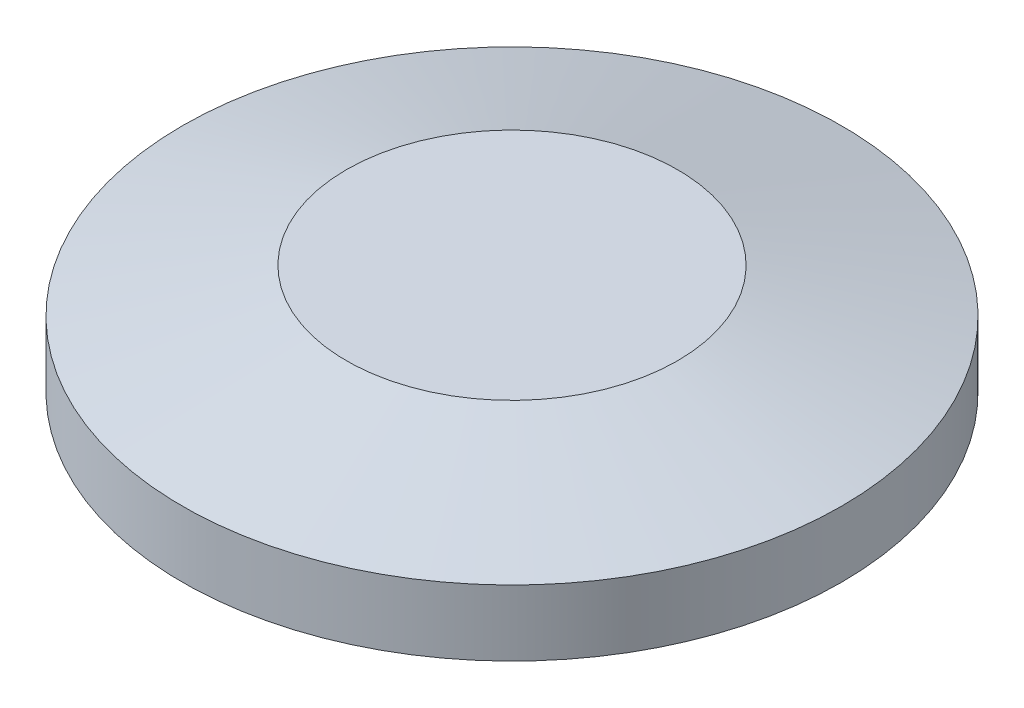
ISO-10303-21;
HEADER;
FILE_DESCRIPTION(('STEP AP214'),'2;1');
FILE_NAME('part.step','',(''),(''),'','','');
FILE_SCHEMA(('AUTOMOTIVE_DESIGN { 1 0 10303 214 1 1 1 1 }'));
ENDSEC;
DATA;
#1=APPLICATION_CONTEXT('core data for automotive mechanical design processes');
#2=APPLICATION_PROTOCOL_DEFINITION('international standard','automotive_design',2000,#1);
#3=PRODUCT_CONTEXT('',#1,'mechanical');
#4=PRODUCT('Part','Part','',(#3));
#5=PRODUCT_RELATED_PRODUCT_CATEGORY('part','',(#4));
#6=PRODUCT_DEFINITION_FORMATION('','',#4);
#7=PRODUCT_DEFINITION_CONTEXT('part definition',#1,'design');
#8=PRODUCT_DEFINITION('design','',#6,#7);
#9=PRODUCT_DEFINITION_SHAPE('','',#8);
#10=(LENGTH_UNIT() NAMED_UNIT(*) SI_UNIT(.MILLI.,.METRE.));
#11=(NAMED_UNIT(*) PLANE_ANGLE_UNIT() SI_UNIT($,.RADIAN.));
#12=(NAMED_UNIT(*) SI_UNIT($,.STERADIAN.) SOLID_ANGLE_UNIT());
#13=UNCERTAINTY_MEASURE_WITH_UNIT(LENGTH_MEASURE(1.E-05),#10,'distance_accuracy_value','');
#14=(GEOMETRIC_REPRESENTATION_CONTEXT(3) GLOBAL_UNCERTAINTY_ASSIGNED_CONTEXT((#13)) GLOBAL_UNIT_ASSIGNED_CONTEXT((#10,
#11,#12)) REPRESENTATION_CONTEXT('',''));
#15=CARTESIAN_POINT('',(0.,0.,0.));
#16=DIRECTION('',(0.,0.,1.));
#17=DIRECTION('',(1.,0.,0.));
#18=AXIS2_PLACEMENT_3D('',#15,#16,#17);
#19=CARTESIAN_POINT('',(0.,-2.5,0.));
#20=DIRECTION('',(0.,-1.,0.));
#21=DIRECTION('',(0.,0.,-1.));
#22=AXIS2_PLACEMENT_3D('',#19,#20,#21);
#23=PLANE('',#22);
#24=CARTESIAN_POINT('',(0.,-2.5,0.));
#25=DIRECTION('',(0.,1.,0.));
#26=DIRECTION('',(-1.,0.,0.));
#27=AXIS2_PLACEMENT_3D('',#24,#25,#26);
#28=CIRCLE('',#27,8.);
#29=CARTESIAN_POINT('',(8.,-2.5,0.));
#30=VERTEX_POINT('',#29);
#31=EDGE_CURVE('E28',#30,#30,#28,.T.);
#32=ORIENTED_EDGE('',*,*,#31,.F.);
#33=EDGE_LOOP('',(#32));
#34=FACE_BOUND('',#33,.T.);
#35=ADVANCED_FACE('F17',(#34),#23,.T.);
#36=CARTESIAN_POINT('',(0.,0.25,0.));
#37=DIRECTION('',(0.,-1.,0.));
#38=DIRECTION('',(-1.,0.,0.));
#39=AXIS2_PLACEMENT_3D('',#36,#37,#38);
#40=CYLINDRICAL_SURFACE('',#39,8.);
#41=ORIENTED_EDGE('',*,*,#31,.T.);
#42=DIRECTION('',(0.,-1.,0.));
#43=VECTOR('',#42,1.);
#44=CARTESIAN_POINT('',(8.,0.25,0.));
#45=LINE('',#44,#43);
#46=CARTESIAN_POINT('',(8.,-5.,0.));
#47=VERTEX_POINT('',#46);
#48=EDGE_CURVE('E11',#30,#47,#45,.T.);
#49=ORIENTED_EDGE('',*,*,#48,.T.);
#50=CARTESIAN_POINT('',(0.,-5.,0.));
#51=DIRECTION('',(0.,-1.,0.));
#52=DIRECTION('',(-1.,0.,0.));
#53=AXIS2_PLACEMENT_3D('',#50,#51,#52);
#54=CIRCLE('',#53,8.);
#55=EDGE_CURVE('E62',#47,#47,#54,.T.);
#56=ORIENTED_EDGE('',*,*,#55,.T.);
#57=ORIENTED_EDGE('',*,*,#48,.F.);
#58=EDGE_LOOP('',(#41,#49,#56,#57));
#59=FACE_BOUND('',#58,.T.);
#60=ADVANCED_FACE('F100',(#59),#40,.F.);
#61=CARTESIAN_POINT('',(0.,-5.,0.));
#62=DIRECTION('',(0.,-1.,0.));
#63=DIRECTION('',(0.,0.,-1.));
#64=AXIS2_PLACEMENT_3D('',#61,#62,#63);
#65=PLANE('',#64);
#66=ORIENTED_EDGE('',*,*,#55,.F.);
#67=EDGE_LOOP('',(#66));
#68=FACE_BOUND('',#67,.T.);
#69=CARTESIAN_POINT('',(0.,-5.,0.));
#70=DIRECTION('',(0.,1.,0.));
#71=DIRECTION('',(-1.,0.,0.));
#72=AXIS2_PLACEMENT_3D('',#69,#70,#71);
#73=CIRCLE('',#72,15.);
#74=CARTESIAN_POINT('',(15.,-5.,0.));
#75=VERTEX_POINT('',#74);
#76=EDGE_CURVE('E21',#75,#75,#73,.T.);
#77=ORIENTED_EDGE('',*,*,#76,.F.);
#78=EDGE_LOOP('',(#77));
#79=FACE_BOUND('',#78,.T.);
#80=ADVANCED_FACE('F97',(#68,#79),#65,.T.);
#81=CARTESIAN_POINT('',(0.,0.25,0.));
#82=DIRECTION('',(0.,-1.,0.));
#83=DIRECTION('',(-1.,0.,0.));
#84=AXIS2_PLACEMENT_3D('',#81,#82,#83);
#85=CYLINDRICAL_SURFACE('',#84,15.);
#86=ORIENTED_EDGE('',*,*,#76,.T.);
#87=DIRECTION('',(0.,1.,0.));
#88=VECTOR('',#87,1.);
#89=CARTESIAN_POINT('',(15.,0.25,0.));
#90=LINE('',#89,#88);
#91=CARTESIAN_POINT('',(15.,-2.,0.));
#92=VERTEX_POINT('',#91);
#93=EDGE_CURVE('E55',#75,#92,#90,.T.);
#94=ORIENTED_EDGE('',*,*,#93,.T.);
#95=CARTESIAN_POINT('',(0.,-2.,0.));
#96=DIRECTION('',(0.,1.,0.));
#97=DIRECTION('',(-1.,0.,0.));
#98=AXIS2_PLACEMENT_3D('',#95,#96,#97);
#99=CIRCLE('',#98,15.);
#100=EDGE_CURVE('E59',#92,#92,#99,.T.);
#101=ORIENTED_EDGE('',*,*,#100,.F.);
#102=ORIENTED_EDGE('',*,*,#93,.F.);
#103=EDGE_LOOP('',(#86,#94,#101,#102));
#104=FACE_BOUND('',#103,.T.);
#105=ADVANCED_FACE('F56',(#104),#85,.T.);
#106=CARTESIAN_POINT('',(0.,-1.,0.));
#107=DIRECTION('',(0.,-1.,0.));
#108=DIRECTION('',(-1.,0.,0.));
#109=AXIS2_PLACEMENT_3D('',#106,#107,#108);
#110=CONICAL_SURFACE('',#109,11.26794919243,1.30899693899575);
#111=ORIENTED_EDGE('',*,*,#100,.T.);
#112=DIRECTION('',(-0.965925826289068,0.258819045102521,0.));
#113=VECTOR('',#112,1.);
#114=CARTESIAN_POINT('',(11.26794919243,-1.,0.));
#115=LINE('',#114,#113);
#116=CARTESIAN_POINT('',(7.535898384862,0.,0.));
#117=VERTEX_POINT('',#116);
#118=EDGE_CURVE('E70',#92,#117,#115,.T.);
#119=ORIENTED_EDGE('',*,*,#118,.T.);
#120=CARTESIAN_POINT('',(0.,0.,0.));
#121=DIRECTION('',(0.,1.,0.));
#122=DIRECTION('',(-1.,0.,0.));
#123=AXIS2_PLACEMENT_3D('',#120,#121,#122);
#124=CIRCLE('',#123,7.535898384862);
#125=EDGE_CURVE('E81',#117,#117,#124,.T.);
#126=ORIENTED_EDGE('',*,*,#125,.F.);
#127=ORIENTED_EDGE('',*,*,#118,.F.);
#128=EDGE_LOOP('',(#111,#119,#126,#127));
#129=FACE_BOUND('',#128,.T.);
#130=ADVANCED_FACE('F19',(#129),#110,.T.);
#131=CARTESIAN_POINT('',(0.,0.,0.));
#132=DIRECTION('',(0.,-1.,0.));
#133=DIRECTION('',(0.,0.,-1.));
#134=AXIS2_PLACEMENT_3D('',#131,#132,#133);
#135=PLANE('',#134);
#136=ORIENTED_EDGE('',*,*,#125,.T.);
#137=EDGE_LOOP('',(#136));
#138=FACE_BOUND('',#137,.T.);
#139=ADVANCED_FACE('F89',(#138),#135,.F.);
#140=CLOSED_SHELL('',(#35,#60,#80,#105,#130,#139));
#141=MANIFOLD_SOLID_BREP('B1',#140);
#142=ADVANCED_BREP_SHAPE_REPRESENTATION('',(#18,#141),#14);
#143=SHAPE_DEFINITION_REPRESENTATION(#9,#142);
ENDSEC;
END-ISO-10303-21;
